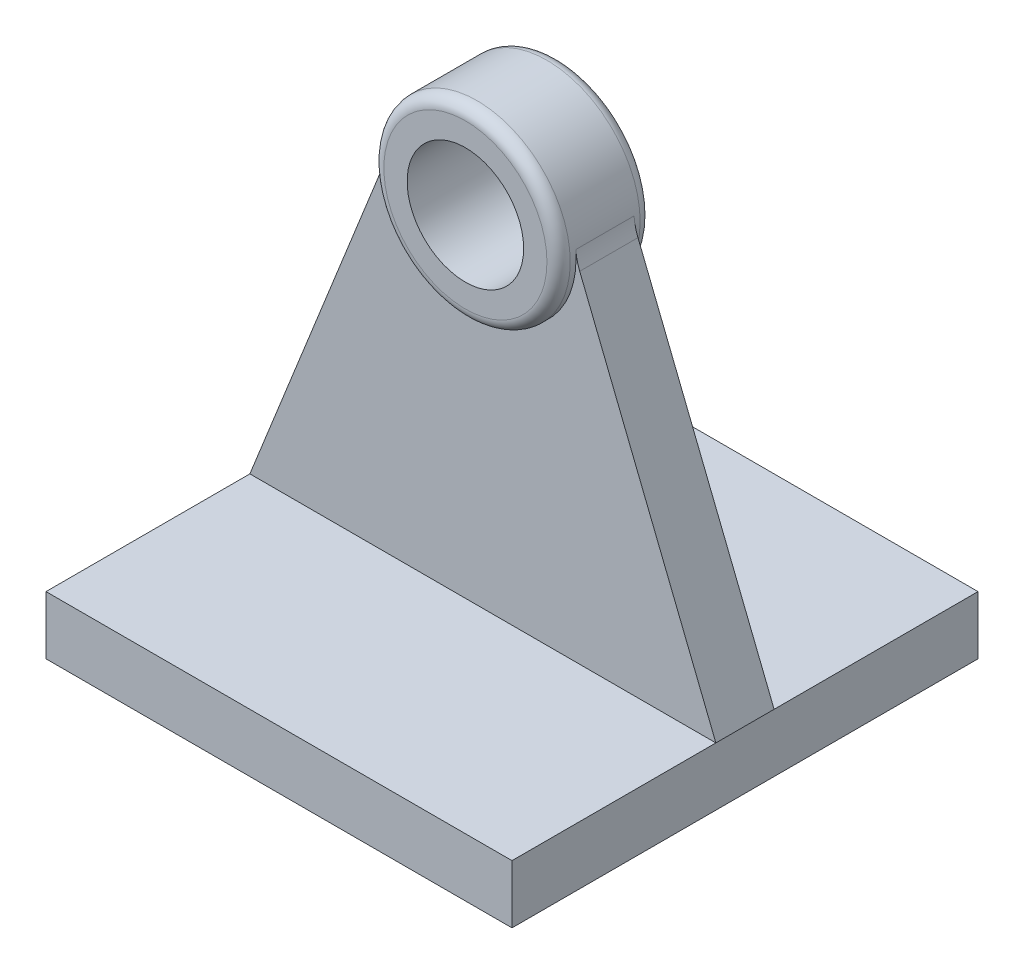
ISO-10303-21;
HEADER;
FILE_DESCRIPTION(('STEP AP214'),'2;1');
FILE_NAME('part.step','',(''),(''),'','','');
FILE_SCHEMA(('AUTOMOTIVE_DESIGN { 1 0 10303 214 1 1 1 1 }'));
ENDSEC;
DATA;
#1=APPLICATION_CONTEXT('core data for automotive mechanical design processes');
#2=APPLICATION_PROTOCOL_DEFINITION('international standard','automotive_design',2000,#1);
#3=PRODUCT_CONTEXT('',#1,'mechanical');
#4=PRODUCT('Part','Part','',(#3));
#5=PRODUCT_RELATED_PRODUCT_CATEGORY('part','',(#4));
#6=PRODUCT_DEFINITION_FORMATION('','',#4);
#7=PRODUCT_DEFINITION_CONTEXT('part definition',#1,'design');
#8=PRODUCT_DEFINITION('design','',#6,#7);
#9=PRODUCT_DEFINITION_SHAPE('','',#8);
#10=(LENGTH_UNIT() NAMED_UNIT(*) SI_UNIT(.MILLI.,.METRE.));
#11=(NAMED_UNIT(*) PLANE_ANGLE_UNIT() SI_UNIT($,.RADIAN.));
#12=(NAMED_UNIT(*) SI_UNIT($,.STERADIAN.) SOLID_ANGLE_UNIT());
#13=UNCERTAINTY_MEASURE_WITH_UNIT(LENGTH_MEASURE(1.E-05),#10,'distance_accuracy_value','');
#14=(GEOMETRIC_REPRESENTATION_CONTEXT(3) GLOBAL_UNCERTAINTY_ASSIGNED_CONTEXT((#13)) GLOBAL_UNIT_ASSIGNED_CONTEXT((#10,
#11,#12)) REPRESENTATION_CONTEXT('',''));
#15=CARTESIAN_POINT('',(0.,0.,0.));
#16=DIRECTION('',(0.,0.,1.));
#17=DIRECTION('',(1.,0.,0.));
#18=AXIS2_PLACEMENT_3D('',#15,#16,#17);
#19=CARTESIAN_POINT('',(0.,6.35,0.));
#20=DIRECTION('',(0.,-1.,0.));
#21=DIRECTION('',(0.,0.,-1.));
#22=AXIS2_PLACEMENT_3D('',#19,#20,#21);
#23=PLANE('',#22);
#24=DIRECTION('',(1.,0.,0.));
#25=VECTOR('',#24,1.);
#26=CARTESIAN_POINT('',(-25.4,6.35,3.175));
#27=LINE('',#26,#25);
#28=CARTESIAN_POINT('',(-25.4,6.35,3.175));
#29=VERTEX_POINT('',#28);
#30=CARTESIAN_POINT('',(25.4,6.35,3.175));
#31=VERTEX_POINT('',#30);
#32=EDGE_CURVE('E131',#29,#31,#27,.T.);
#33=ORIENTED_EDGE('',*,*,#32,.F.);
#34=DIRECTION('',(0.,0.,1.));
#35=VECTOR('',#34,1.);
#36=CARTESIAN_POINT('',(-25.4,6.35,25.4));
#37=LINE('',#36,#35);
#38=CARTESIAN_POINT('',(-25.4,6.35,25.4));
#39=VERTEX_POINT('',#38);
#40=EDGE_CURVE('E184',#29,#39,#37,.T.);
#41=ORIENTED_EDGE('',*,*,#40,.T.);
#42=DIRECTION('',(1.,0.,0.));
#43=VECTOR('',#42,1.);
#44=CARTESIAN_POINT('',(-25.4,6.35,25.4));
#45=LINE('',#44,#43);
#46=CARTESIAN_POINT('',(25.4,6.35,25.4));
#47=VERTEX_POINT('',#46);
#48=EDGE_CURVE('E134',#39,#47,#45,.T.);
#49=ORIENTED_EDGE('',*,*,#48,.T.);
#50=DIRECTION('',(0.,0.,-1.));
#51=VECTOR('',#50,1.);
#52=CARTESIAN_POINT('',(25.4,6.35,25.4));
#53=LINE('',#52,#51);
#54=EDGE_CURVE('E128',#47,#31,#53,.T.);
#55=ORIENTED_EDGE('',*,*,#54,.T.);
#56=EDGE_LOOP('',(#33,#41,#49,#55));
#57=FACE_BOUND('',#56,.T.);
#58=ADVANCED_FACE('F49',(#57),#23,.F.);
#59=CARTESIAN_POINT('',(25.4,6.35,25.4));
#60=DIRECTION('',(-1.,0.,0.));
#61=DIRECTION('',(0.,0.,1.));
#62=AXIS2_PLACEMENT_3D('',#59,#60,#61);
#63=PLANE('',#62);
#64=DIRECTION('',(0.,0.,-1.));
#65=VECTOR('',#64,1.);
#66=CARTESIAN_POINT('',(25.4,0.,25.4));
#67=LINE('',#66,#65);
#68=CARTESIAN_POINT('',(25.4,0.,25.4));
#69=VERTEX_POINT('',#68);
#70=CARTESIAN_POINT('',(25.4,0.,-25.4));
#71=VERTEX_POINT('',#70);
#72=EDGE_CURVE('E180',#69,#71,#67,.T.);
#73=ORIENTED_EDGE('',*,*,#72,.T.);
#74=DIRECTION('',(0.,-1.,0.));
#75=VECTOR('',#74,1.);
#76=CARTESIAN_POINT('',(25.4,6.35,-25.4));
#77=LINE('',#76,#75);
#78=CARTESIAN_POINT('',(25.4,6.35,-25.4));
#79=VERTEX_POINT('',#78);
#80=EDGE_CURVE('E213',#79,#71,#77,.T.);
#81=ORIENTED_EDGE('',*,*,#80,.F.);
#82=CARTESIAN_POINT('',(25.4,6.35,-3.175));
#83=VERTEX_POINT('',#82);
#84=EDGE_CURVE('E140',#83,#79,#53,.T.);
#85=ORIENTED_EDGE('',*,*,#84,.F.);
#86=DIRECTION('',(0.,0.,-1.));
#87=VECTOR('',#86,1.);
#88=CARTESIAN_POINT('',(25.4,6.35,3.175));
#89=LINE('',#88,#87);
#90=EDGE_CURVE('E144',#31,#83,#89,.T.);
#91=ORIENTED_EDGE('',*,*,#90,.F.);
#92=ORIENTED_EDGE('',*,*,#54,.F.);
#93=DIRECTION('',(0.,-1.,0.));
#94=VECTOR('',#93,1.);
#95=CARTESIAN_POINT('',(25.4,6.35,25.4));
#96=LINE('',#95,#94);
#97=EDGE_CURVE('E191',#47,#69,#96,.T.);
#98=ORIENTED_EDGE('',*,*,#97,.T.);
#99=EDGE_LOOP('',(#73,#81,#85,#91,#92,#98));
#100=FACE_BOUND('',#99,.T.);
#101=ADVANCED_FACE('F146',(#100),#63,.F.);
#102=CARTESIAN_POINT('',(-25.4,6.35,-25.4));
#103=DIRECTION('',(0.,0.,1.));
#104=DIRECTION('',(1.,0.,0.));
#105=AXIS2_PLACEMENT_3D('',#102,#103,#104);
#106=PLANE('',#105);
#107=DIRECTION('',(-1.,0.,0.));
#108=VECTOR('',#107,1.);
#109=CARTESIAN_POINT('',(-25.4,0.,-25.4));
#110=LINE('',#109,#108);
#111=CARTESIAN_POINT('',(-25.4,0.,-25.4));
#112=VERTEX_POINT('',#111);
#113=EDGE_CURVE('E194',#71,#112,#110,.T.);
#114=ORIENTED_EDGE('',*,*,#113,.T.);
#115=DIRECTION('',(0.,-1.,0.));
#116=VECTOR('',#115,1.);
#117=CARTESIAN_POINT('',(-25.4,6.35,-25.4));
#118=LINE('',#117,#116);
#119=CARTESIAN_POINT('',(-25.4,6.35,-25.4));
#120=VERTEX_POINT('',#119);
#121=EDGE_CURVE('E209',#120,#112,#118,.T.);
#122=ORIENTED_EDGE('',*,*,#121,.F.);
#123=DIRECTION('',(-1.,0.,0.));
#124=VECTOR('',#123,1.);
#125=CARTESIAN_POINT('',(-25.4,6.35,-25.4));
#126=LINE('',#125,#124);
#127=EDGE_CURVE('E139',#79,#120,#126,.T.);
#128=ORIENTED_EDGE('',*,*,#127,.F.);
#129=ORIENTED_EDGE('',*,*,#80,.T.);
#130=EDGE_LOOP('',(#114,#122,#128,#129));
#131=FACE_BOUND('',#130,.T.);
#132=ADVANCED_FACE('F262',(#131),#106,.F.);
#133=CARTESIAN_POINT('',(-25.4,6.35,25.4));
#134=DIRECTION('',(1.,0.,0.));
#135=DIRECTION('',(0.,0.,-1.));
#136=AXIS2_PLACEMENT_3D('',#133,#134,#135);
#137=PLANE('',#136);
#138=DIRECTION('',(0.,0.,1.));
#139=VECTOR('',#138,1.);
#140=CARTESIAN_POINT('',(-25.4,0.,25.4));
#141=LINE('',#140,#139);
#142=CARTESIAN_POINT('',(-25.4,0.,25.4));
#143=VERTEX_POINT('',#142);
#144=EDGE_CURVE('E197',#112,#143,#141,.T.);
#145=ORIENTED_EDGE('',*,*,#144,.T.);
#146=DIRECTION('',(0.,-1.,0.));
#147=VECTOR('',#146,1.);
#148=CARTESIAN_POINT('',(-25.4,6.35,25.4));
#149=LINE('',#148,#147);
#150=EDGE_CURVE('E205',#39,#143,#149,.T.);
#151=ORIENTED_EDGE('',*,*,#150,.F.);
#152=ORIENTED_EDGE('',*,*,#40,.F.);
#153=DIRECTION('',(0.,0.,-1.));
#154=VECTOR('',#153,1.);
#155=CARTESIAN_POINT('',(-25.4,6.35,3.175));
#156=LINE('',#155,#154);
#157=CARTESIAN_POINT('',(-25.4,6.35,-3.175));
#158=VERTEX_POINT('',#157);
#159=EDGE_CURVE('E149',#29,#158,#156,.T.);
#160=ORIENTED_EDGE('',*,*,#159,.T.);
#161=EDGE_CURVE('E185',#120,#158,#37,.T.);
#162=ORIENTED_EDGE('',*,*,#161,.F.);
#163=ORIENTED_EDGE('',*,*,#121,.T.);
#164=EDGE_LOOP('',(#145,#151,#152,#160,#162,#163));
#165=FACE_BOUND('',#164,.T.);
#166=ADVANCED_FACE('F270',(#165),#137,.F.);
#167=CARTESIAN_POINT('',(-25.4,6.35,25.4));
#168=DIRECTION('',(0.,0.,-1.));
#169=DIRECTION('',(-1.,0.,0.));
#170=AXIS2_PLACEMENT_3D('',#167,#168,#169);
#171=PLANE('',#170);
#172=DIRECTION('',(1.,0.,0.));
#173=VECTOR('',#172,1.);
#174=CARTESIAN_POINT('',(-25.4,0.,25.4));
#175=LINE('',#174,#173);
#176=EDGE_CURVE('E200',#143,#69,#175,.T.);
#177=ORIENTED_EDGE('',*,*,#176,.T.);
#178=ORIENTED_EDGE('',*,*,#97,.F.);
#179=ORIENTED_EDGE('',*,*,#48,.F.);
#180=ORIENTED_EDGE('',*,*,#150,.T.);
#181=EDGE_LOOP('',(#177,#178,#179,#180));
#182=FACE_BOUND('',#181,.T.);
#183=ADVANCED_FACE('F322',(#182),#171,.F.);
#184=ORIENTED_EDGE('',*,*,#161,.T.);
#185=DIRECTION('',(1.,0.,0.));
#186=VECTOR('',#185,1.);
#187=CARTESIAN_POINT('',(-25.4,6.35,-3.175));
#188=LINE('',#187,#186);
#189=EDGE_CURVE('E171',#158,#83,#188,.T.);
#190=ORIENTED_EDGE('',*,*,#189,.T.);
#191=ORIENTED_EDGE('',*,*,#84,.T.);
#192=ORIENTED_EDGE('',*,*,#127,.T.);
#193=EDGE_LOOP('',(#184,#190,#191,#192));
#194=FACE_BOUND('',#193,.T.);
#195=ADVANCED_FACE('F258',(#194),#23,.F.);
#196=CARTESIAN_POINT('',(0.,0.,0.));
#197=DIRECTION('',(0.,-1.,0.));
#198=DIRECTION('',(0.,0.,-1.));
#199=AXIS2_PLACEMENT_3D('',#196,#197,#198);
#200=PLANE('',#199);
#201=ORIENTED_EDGE('',*,*,#72,.F.);
#202=ORIENTED_EDGE('',*,*,#176,.F.);
#203=ORIENTED_EDGE('',*,*,#144,.F.);
#204=ORIENTED_EDGE('',*,*,#113,.F.);
#205=EDGE_LOOP('',(#201,#202,#203,#204));
#206=FACE_BOUND('',#205,.T.);
#207=ADVANCED_FACE('F267',(#206),#200,.T.);
#208=CARTESIAN_POINT('',(-10.16,44.45,3.175));
#209=DIRECTION('',(0.928476690885259,-0.371390676354104,0.));
#210=DIRECTION('',(0.371390676354104,0.928476690885259,0.));
#211=AXIS2_PLACEMENT_3D('',#208,#209,#210);
#212=PLANE('',#211);
#213=DIRECTION('',(-0.371390676354104,-0.928476690885259,0.));
#214=VECTOR('',#213,1.);
#215=CARTESIAN_POINT('',(-10.16,44.45,3.175));
#216=LINE('',#215,#214);
#217=CARTESIAN_POINT('',(-10.5577319420775,43.4556701448063,3.175));
#218=VERTEX_POINT('',#217);
#219=EDGE_CURVE('E156',#218,#29,#216,.T.);
#220=ORIENTED_EDGE('',*,*,#219,.F.);
#221=DIRECTION('',(0.,0.,1.));
#222=VECTOR('',#221,1.);
#223=CARTESIAN_POINT('',(-10.5577319420775,43.4556701448063,-3.175));
#224=LINE('',#223,#222);
#225=CARTESIAN_POINT('',(-10.5577319420775,43.4556701448063,-3.175));
#226=VERTEX_POINT('',#225);
#227=EDGE_CURVE('E233',#218,#226,#224,.F.);
#228=ORIENTED_EDGE('',*,*,#227,.T.);
#229=DIRECTION('',(-0.371390676354104,-0.928476690885259,0.));
#230=VECTOR('',#229,1.);
#231=CARTESIAN_POINT('',(-10.16,44.45,-3.175));
#232=LINE('',#231,#230);
#233=EDGE_CURVE('E167',#226,#158,#232,.T.);
#234=ORIENTED_EDGE('',*,*,#233,.T.);
#235=ORIENTED_EDGE('',*,*,#159,.F.);
#236=EDGE_LOOP('',(#220,#228,#234,#235));
#237=FACE_BOUND('',#236,.T.);
#238=ADVANCED_FACE('F287',(#237),#212,.F.);
#239=CARTESIAN_POINT('',(25.4,6.35,3.175));
#240=DIRECTION('',(-0.928476690885259,-0.371390676354103,0.));
#241=DIRECTION('',(0.371390676354104,-0.92847669088526,0.));
#242=AXIS2_PLACEMENT_3D('',#239,#240,#241);
#243=PLANE('',#242);
#244=DIRECTION('',(-0.371390676354103,0.928476690885259,0.));
#245=VECTOR('',#244,1.);
#246=CARTESIAN_POINT('',(25.4,6.35,-3.175));
#247=LINE('',#246,#245);
#248=CARTESIAN_POINT('',(10.5577319420775,43.4556701448062,-3.175));
#249=VERTEX_POINT('',#248);
#250=EDGE_CURVE('E174',#83,#249,#247,.T.);
#251=ORIENTED_EDGE('',*,*,#250,.T.);
#252=DIRECTION('',(0.,0.,1.));
#253=VECTOR('',#252,1.);
#254=CARTESIAN_POINT('',(10.5577319420775,43.4556701448062,3.175));
#255=LINE('',#254,#253);
#256=CARTESIAN_POINT('',(10.5577319420775,43.4556701448062,3.175));
#257=VERTEX_POINT('',#256);
#258=EDGE_CURVE('E65',#249,#257,#255,.T.);
#259=ORIENTED_EDGE('',*,*,#258,.T.);
#260=DIRECTION('',(-0.371390676354103,0.928476690885259,0.));
#261=VECTOR('',#260,1.);
#262=CARTESIAN_POINT('',(25.4,6.35,3.175));
#263=LINE('',#262,#261);
#264=EDGE_CURVE('E150',#31,#257,#263,.T.);
#265=ORIENTED_EDGE('',*,*,#264,.F.);
#266=ORIENTED_EDGE('',*,*,#90,.T.);
#267=EDGE_LOOP('',(#251,#259,#265,#266));
#268=FACE_BOUND('',#267,.T.);
#269=ADVANCED_FACE('F159',(#268),#243,.F.);
#270=CARTESIAN_POINT('',(0.,44.45,3.175));
#271=DIRECTION('',(0.,0.,1.));
#272=DIRECTION('',(1.,0.,0.));
#273=AXIS2_PLACEMENT_3D('',#270,#271,#272);
#274=PLANE('',#273);
#275=CARTESIAN_POINT('',(0.,44.45,3.175));
#276=DIRECTION('',(0.,0.,-1.));
#277=DIRECTION('',(1.,0.,0.));
#278=AXIS2_PLACEMENT_3D('',#275,#276,#277);
#279=CIRCLE('',#278,10.16);
#280=CARTESIAN_POINT('',(10.1252670333532,45.2893851936337,3.175));
#281=VERTEX_POINT('',#280);
#282=CARTESIAN_POINT('',(-10.1252670333532,45.2893851936337,3.175));
#283=VERTEX_POINT('',#282);
#284=EDGE_CURVE('E176',#281,#283,#279,.T.);
#285=ORIENTED_EDGE('',*,*,#284,.T.);
#286=CARTESIAN_POINT('',(-16.4535589291989,45.8140009396548,3.175));
#287=DIRECTION('',(0.,0.,1.));
#288=DIRECTION('',(1.,0.,0.));
#289=AXIS2_PLACEMENT_3D('',#286,#287,#288);
#290=CIRCLE('',#289,6.35);
#291=EDGE_CURVE('E251',#283,#218,#290,.F.);
#292=ORIENTED_EDGE('',*,*,#291,.T.);
#293=ORIENTED_EDGE('',*,*,#219,.T.);
#294=ORIENTED_EDGE('',*,*,#32,.T.);
#295=ORIENTED_EDGE('',*,*,#264,.T.);
#296=CARTESIAN_POINT('',(16.4535589291989,45.8140009396548,3.175));
#297=DIRECTION('',(0.,0.,1.));
#298=DIRECTION('',(1.,0.,0.));
#299=AXIS2_PLACEMENT_3D('',#296,#297,#298);
#300=CIRCLE('',#299,6.35);
#301=EDGE_CURVE('E11',#257,#281,#300,.F.);
#302=ORIENTED_EDGE('',*,*,#301,.T.);
#303=EDGE_LOOP('',(#285,#292,#293,#294,#295,#302));
#304=FACE_BOUND('',#303,.T.);
#305=ADVANCED_FACE('F153',(#304),#274,.T.);
#306=CARTESIAN_POINT('',(0.,44.45,-3.175));
#307=DIRECTION('',(0.,0.,1.));
#308=DIRECTION('',(1.,0.,0.));
#309=AXIS2_PLACEMENT_3D('',#306,#307,#308);
#310=PLANE('',#309);
#311=CARTESIAN_POINT('',(0.,44.45,-3.175));
#312=DIRECTION('',(0.,0.,-1.));
#313=DIRECTION('',(1.,0.,0.));
#314=AXIS2_PLACEMENT_3D('',#311,#312,#313);
#315=CIRCLE('',#314,10.16);
#316=CARTESIAN_POINT('',(10.1252670333532,45.2893851936337,-3.175));
#317=VERTEX_POINT('',#316);
#318=CARTESIAN_POINT('',(-10.1252670333532,45.2893851936337,-3.175));
#319=VERTEX_POINT('',#318);
#320=EDGE_CURVE('E164',#317,#319,#315,.T.);
#321=ORIENTED_EDGE('',*,*,#320,.F.);
#322=CARTESIAN_POINT('',(16.4535589291989,45.8140009396548,-3.175));
#323=DIRECTION('',(0.,0.,1.));
#324=DIRECTION('',(1.,0.,0.));
#325=AXIS2_PLACEMENT_3D('',#322,#323,#324);
#326=CIRCLE('',#325,6.35);
#327=EDGE_CURVE('E58',#317,#249,#326,.T.);
#328=ORIENTED_EDGE('',*,*,#327,.T.);
#329=ORIENTED_EDGE('',*,*,#250,.F.);
#330=ORIENTED_EDGE('',*,*,#189,.F.);
#331=ORIENTED_EDGE('',*,*,#233,.F.);
#332=CARTESIAN_POINT('',(-16.4535589291989,45.8140009396548,-3.175));
#333=DIRECTION('',(0.,0.,1.));
#334=DIRECTION('',(1.,0.,0.));
#335=AXIS2_PLACEMENT_3D('',#332,#333,#334);
#336=CIRCLE('',#335,6.35);
#337=EDGE_CURVE('E247',#226,#319,#336,.T.);
#338=ORIENTED_EDGE('',*,*,#337,.T.);
#339=EDGE_LOOP('',(#321,#328,#329,#330,#331,#338));
#340=FACE_BOUND('',#339,.T.);
#341=ADVANCED_FACE('F274',(#340),#310,.F.);
#342=CARTESIAN_POINT('',(0.,44.45,5.08));
#343=DIRECTION('',(0.,0.,1.));
#344=DIRECTION('',(1.,0.,0.));
#345=AXIS2_PLACEMENT_3D('',#342,#343,#344);
#346=PLANE('',#345);
#347=CARTESIAN_POINT('',(0.,44.45,5.08));
#348=DIRECTION('',(0.,0.,1.));
#349=DIRECTION('',(1.,0.,0.));
#350=AXIS2_PLACEMENT_3D('',#347,#348,#349);
#351=CIRCLE('',#350,8.89);
#352=CARTESIAN_POINT('',(8.89,44.45,5.08));
#353=VERTEX_POINT('',#352);
#354=EDGE_CURVE('E229',#353,#353,#351,.T.);
#355=ORIENTED_EDGE('',*,*,#354,.T.);
#356=EDGE_LOOP('',(#355));
#357=FACE_BOUND('',#356,.T.);
#358=CARTESIAN_POINT('',(0.,44.45,5.08));
#359=DIRECTION('',(0.,0.,1.));
#360=DIRECTION('',(1.,0.,0.));
#361=AXIS2_PLACEMENT_3D('',#358,#359,#360);
#362=CIRCLE('',#361,6.35);
#363=CARTESIAN_POINT('',(6.35,44.45,5.08));
#364=VERTEX_POINT('',#363);
#365=EDGE_CURVE('E168',#364,#364,#362,.T.);
#366=ORIENTED_EDGE('',*,*,#365,.F.);
#367=EDGE_LOOP('',(#366));
#368=FACE_BOUND('',#367,.T.);
#369=ADVANCED_FACE('F301',(#357,#368),#346,.T.);
#370=CARTESIAN_POINT('',(0.,44.45,-5.08));
#371=DIRECTION('',(0.,0.,1.));
#372=DIRECTION('',(1.,0.,0.));
#373=AXIS2_PLACEMENT_3D('',#370,#371,#372);
#374=PLANE('',#373);
#375=CARTESIAN_POINT('',(0.,44.45,-5.08));
#376=DIRECTION('',(0.,0.,1.));
#377=DIRECTION('',(1.,0.,0.));
#378=AXIS2_PLACEMENT_3D('',#375,#376,#377);
#379=CIRCLE('',#378,8.89);
#380=CARTESIAN_POINT('',(8.89,44.45,-5.08));
#381=VERTEX_POINT('',#380);
#382=EDGE_CURVE('E225',#381,#381,#379,.F.);
#383=ORIENTED_EDGE('',*,*,#382,.T.);
#384=EDGE_LOOP('',(#383));
#385=FACE_BOUND('',#384,.T.);
#386=CARTESIAN_POINT('',(0.,44.45,-5.08));
#387=DIRECTION('',(0.,0.,1.));
#388=DIRECTION('',(1.,0.,0.));
#389=AXIS2_PLACEMENT_3D('',#386,#387,#388);
#390=CIRCLE('',#389,6.35);
#391=CARTESIAN_POINT('',(6.35,44.45,-5.08));
#392=VERTEX_POINT('',#391);
#393=EDGE_CURVE('E290',#392,#392,#390,.T.);
#394=ORIENTED_EDGE('',*,*,#393,.T.);
#395=EDGE_LOOP('',(#394));
#396=FACE_BOUND('',#395,.T.);
#397=ADVANCED_FACE('F303',(#385,#396),#374,.F.);
#398=CARTESIAN_POINT('',(0.,44.45,5.08));
#399=DIRECTION('',(0.,0.,-1.));
#400=DIRECTION('',(-1.,0.,0.));
#401=AXIS2_PLACEMENT_3D('',#398,#399,#400);
#402=CYLINDRICAL_SURFACE('',#401,10.16);
#403=CARTESIAN_POINT('',(0.,44.45,-3.81));
#404=DIRECTION('',(0.,0.,1.));
#405=DIRECTION('',(1.,0.,0.));
#406=AXIS2_PLACEMENT_3D('',#403,#404,#405);
#407=CIRCLE('',#406,10.16);
#408=CARTESIAN_POINT('',(10.16,44.45,-3.81));
#409=VERTEX_POINT('',#408);
#410=EDGE_CURVE('E221',#409,#409,#407,.T.);
#411=ORIENTED_EDGE('',*,*,#410,.T.);
#412=EDGE_LOOP('',(#411));
#413=FACE_BOUND('',#412,.T.);
#414=CARTESIAN_POINT('',(0.,44.45,3.81));
#415=DIRECTION('',(0.,0.,1.));
#416=DIRECTION('',(1.,0.,0.));
#417=AXIS2_PLACEMENT_3D('',#414,#415,#416);
#418=CIRCLE('',#417,10.16);
#419=CARTESIAN_POINT('',(10.16,44.45,3.81));
#420=VERTEX_POINT('',#419);
#421=EDGE_CURVE('E217',#420,#420,#418,.F.);
#422=ORIENTED_EDGE('',*,*,#421,.T.);
#423=EDGE_LOOP('',(#422));
#424=FACE_BOUND('',#423,.T.);
#425=ORIENTED_EDGE('',*,*,#320,.T.);
#426=DIRECTION('',(0.,0.,-1.));
#427=VECTOR('',#426,1.);
#428=CARTESIAN_POINT('',(-10.1252670333532,45.2893851936337,5.08));
#429=LINE('',#428,#427);
#430=EDGE_CURVE('E241',#319,#283,#429,.F.);
#431=ORIENTED_EDGE('',*,*,#430,.T.);
#432=ORIENTED_EDGE('',*,*,#284,.F.);
#433=DIRECTION('',(0.,0.,-1.));
#434=VECTOR('',#433,1.);
#435=CARTESIAN_POINT('',(10.1252670333532,45.2893851936337,5.08));
#436=LINE('',#435,#434);
#437=EDGE_CURVE('E237',#281,#317,#436,.T.);
#438=ORIENTED_EDGE('',*,*,#437,.T.);
#439=EDGE_LOOP('',(#425,#431,#432,#438));
#440=FACE_BOUND('',#439,.T.);
#441=ADVANCED_FACE('F282',(#413,#424,#440),#402,.T.);
#442=CARTESIAN_POINT('',(0.,44.45,5.08));
#443=DIRECTION('',(0.,0.,-1.));
#444=DIRECTION('',(-1.,0.,0.));
#445=AXIS2_PLACEMENT_3D('',#442,#443,#444);
#446=CYLINDRICAL_SURFACE('',#445,6.35);
#447=ORIENTED_EDGE('',*,*,#365,.T.);
#448=EDGE_LOOP('',(#447));
#449=FACE_BOUND('',#448,.T.);
#450=ORIENTED_EDGE('',*,*,#393,.F.);
#451=EDGE_LOOP('',(#450));
#452=FACE_BOUND('',#451,.T.);
#453=ADVANCED_FACE('F298',(#449,#452),#446,.F.);
#454=CARTESIAN_POINT('',(0.,44.45,-3.81));
#455=DIRECTION('',(0.,0.,1.));
#456=DIRECTION('',(1.,0.,0.));
#457=AXIS2_PLACEMENT_3D('',#454,#455,#456);
#458=TOROIDAL_SURFACE('',#457,8.89,1.27);
#459=ORIENTED_EDGE('',*,*,#382,.F.);
#460=EDGE_LOOP('',(#459));
#461=FACE_BOUND('',#460,.T.);
#462=ORIENTED_EDGE('',*,*,#410,.F.);
#463=EDGE_LOOP('',(#462));
#464=FACE_BOUND('',#463,.T.);
#465=ADVANCED_FACE('F335',(#461,#464),#458,.T.);
#466=CARTESIAN_POINT('',(0.,44.45,3.81));
#467=DIRECTION('',(0.,0.,1.));
#468=DIRECTION('',(1.,0.,0.));
#469=AXIS2_PLACEMENT_3D('',#466,#467,#468);
#470=TOROIDAL_SURFACE('',#469,8.89,1.27);
#471=ORIENTED_EDGE('',*,*,#421,.F.);
#472=EDGE_LOOP('',(#471));
#473=FACE_BOUND('',#472,.T.);
#474=ORIENTED_EDGE('',*,*,#354,.F.);
#475=EDGE_LOOP('',(#474));
#476=FACE_BOUND('',#475,.T.);
#477=ADVANCED_FACE('F338',(#473,#476),#470,.T.);
#478=CARTESIAN_POINT('',(-16.4535589291989,45.8140009396548,5.08));
#479=DIRECTION('',(0.,0.,-1.));
#480=DIRECTION('',(-1.,0.,0.));
#481=AXIS2_PLACEMENT_3D('',#478,#479,#480);
#482=CYLINDRICAL_SURFACE('',#481,6.35);
#483=ORIENTED_EDGE('',*,*,#291,.F.);
#484=ORIENTED_EDGE('',*,*,#430,.F.);
#485=ORIENTED_EDGE('',*,*,#337,.F.);
#486=ORIENTED_EDGE('',*,*,#227,.F.);
#487=EDGE_LOOP('',(#483,#484,#485,#486));
#488=FACE_BOUND('',#487,.T.);
#489=ADVANCED_FACE('F285',(#488),#482,.F.);
#490=CARTESIAN_POINT('',(16.4535589291989,45.8140009396548,5.08));
#491=DIRECTION('',(0.,0.,-1.));
#492=DIRECTION('',(-1.,0.,0.));
#493=AXIS2_PLACEMENT_3D('',#490,#491,#492);
#494=CYLINDRICAL_SURFACE('',#493,6.35);
#495=ORIENTED_EDGE('',*,*,#301,.F.);
#496=ORIENTED_EDGE('',*,*,#258,.F.);
#497=ORIENTED_EDGE('',*,*,#327,.F.);
#498=ORIENTED_EDGE('',*,*,#437,.F.);
#499=EDGE_LOOP('',(#495,#496,#497,#498));
#500=FACE_BOUND('',#499,.T.);
#501=ADVANCED_FACE('F51',(#500),#494,.F.);
#502=CLOSED_SHELL('',(#58,#101,#132,#166,#183,#195,#207,#238,#269,#305,#341,#369,#397,#441,#453,
#465,#477,#489,#501));
#503=MANIFOLD_SOLID_BREP('B2',#502);
#504=ADVANCED_BREP_SHAPE_REPRESENTATION('',(#18,#503),#14);
#505=SHAPE_DEFINITION_REPRESENTATION(#9,#504);
ENDSEC;
END-ISO-10303-21;
